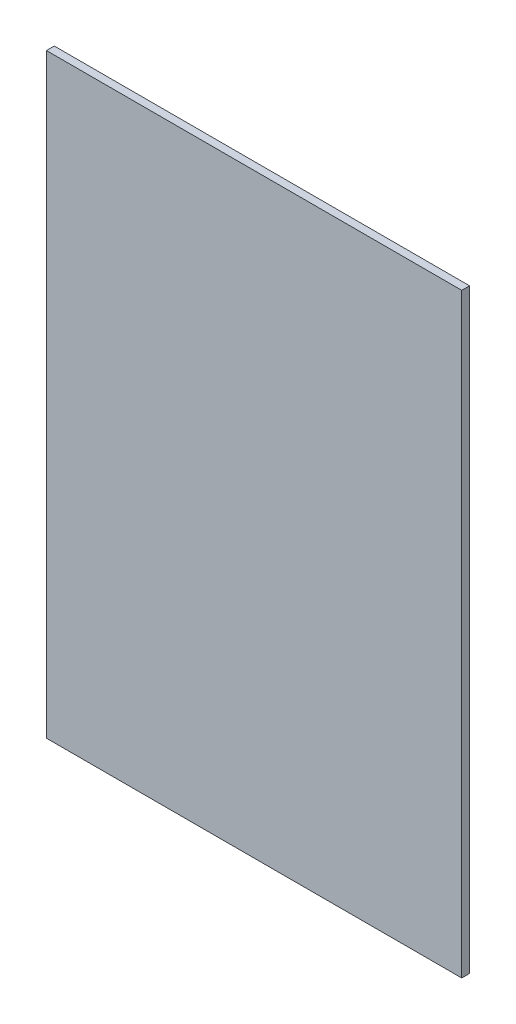
ISO-10303-21;
HEADER;
FILE_DESCRIPTION(('STEP AP214'),'2;1');
FILE_NAME('part.step','',(''),(''),'','','');
FILE_SCHEMA(('AUTOMOTIVE_DESIGN { 1 0 10303 214 1 1 1 1 }'));
ENDSEC;
DATA;
#1=APPLICATION_CONTEXT('core data for automotive mechanical design processes');
#2=APPLICATION_PROTOCOL_DEFINITION('international standard','automotive_design',2000,#1);
#3=PRODUCT_CONTEXT('',#1,'mechanical');
#4=PRODUCT('Part','Part','',(#3));
#5=PRODUCT_RELATED_PRODUCT_CATEGORY('part','',(#4));
#6=PRODUCT_DEFINITION_FORMATION('','',#4);
#7=PRODUCT_DEFINITION_CONTEXT('part definition',#1,'design');
#8=PRODUCT_DEFINITION('design','',#6,#7);
#9=PRODUCT_DEFINITION_SHAPE('','',#8);
#10=(LENGTH_UNIT() NAMED_UNIT(*) SI_UNIT(.MILLI.,.METRE.));
#11=(NAMED_UNIT(*) PLANE_ANGLE_UNIT() SI_UNIT($,.RADIAN.));
#12=(NAMED_UNIT(*) SI_UNIT($,.STERADIAN.) SOLID_ANGLE_UNIT());
#13=UNCERTAINTY_MEASURE_WITH_UNIT(LENGTH_MEASURE(1.E-05),#10,'distance_accuracy_value','');
#14=(GEOMETRIC_REPRESENTATION_CONTEXT(3) GLOBAL_UNCERTAINTY_ASSIGNED_CONTEXT((#13)) GLOBAL_UNIT_ASSIGNED_CONTEXT((#10,
#11,#12)) REPRESENTATION_CONTEXT('',''));
#15=CARTESIAN_POINT('',(0.,0.,0.));
#16=DIRECTION('',(0.,0.,1.));
#17=DIRECTION('',(1.,0.,0.));
#18=AXIS2_PLACEMENT_3D('',#15,#16,#17);
#19=CARTESIAN_POINT('',(0.,0.,0.));
#20=DIRECTION('',(0.,0.,1.));
#21=DIRECTION('',(1.,0.,0.));
#22=AXIS2_PLACEMENT_3D('',#19,#20,#21);
#23=PLANE('',#22);
#24=DIRECTION('',(0.,1.,0.));
#25=VECTOR('',#24,1.);
#26=CARTESIAN_POINT('',(0.,482.6,0.));
#27=LINE('',#26,#25);
#28=CARTESIAN_POINT('',(0.,482.6,0.));
#29=VERTEX_POINT('',#28);
#30=CARTESIAN_POINT('',(0.,0.,0.));
#31=VERTEX_POINT('',#30);
#32=EDGE_CURVE('E95',#29,#31,#27,.F.);
#33=ORIENTED_EDGE('',*,*,#32,.F.);
#34=DIRECTION('',(1.,0.,0.));
#35=VECTOR('',#34,1.);
#36=CARTESIAN_POINT('',(336.55,482.6,0.));
#37=LINE('',#36,#35);
#38=CARTESIAN_POINT('',(336.55,482.6,0.));
#39=VERTEX_POINT('',#38);
#40=EDGE_CURVE('E71',#39,#29,#37,.F.);
#41=ORIENTED_EDGE('',*,*,#40,.F.);
#42=DIRECTION('',(0.,1.,0.));
#43=VECTOR('',#42,1.);
#44=CARTESIAN_POINT('',(336.55,0.,0.));
#45=LINE('',#44,#43);
#46=CARTESIAN_POINT('',(336.55,0.,0.));
#47=VERTEX_POINT('',#46);
#48=EDGE_CURVE('E73',#47,#39,#45,.T.);
#49=ORIENTED_EDGE('',*,*,#48,.F.);
#50=DIRECTION('',(1.,0.,0.));
#51=VECTOR('',#50,1.);
#52=CARTESIAN_POINT('',(0.,0.,0.));
#53=LINE('',#52,#51);
#54=EDGE_CURVE('E36',#31,#47,#53,.T.);
#55=ORIENTED_EDGE('',*,*,#54,.F.);
#56=EDGE_LOOP('',(#33,#41,#49,#55));
#57=FACE_BOUND('',#56,.T.);
#58=ADVANCED_FACE('F33',(#57),#23,.F.);
#59=CARTESIAN_POINT('',(0.,0.,0.));
#60=DIRECTION('',(0.,-1.,0.));
#61=DIRECTION('',(0.,0.,-1.));
#62=AXIS2_PLACEMENT_3D('',#59,#60,#61);
#63=PLANE('',#62);
#64=DIRECTION('',(1.,0.,0.));
#65=VECTOR('',#64,1.);
#66=CARTESIAN_POINT('',(0.,0.,6.35));
#67=LINE('',#66,#65);
#68=CARTESIAN_POINT('',(0.,0.,6.35));
#69=VERTEX_POINT('',#68);
#70=CARTESIAN_POINT('',(336.55,0.,6.35));
#71=VERTEX_POINT('',#70);
#72=EDGE_CURVE('E99',#69,#71,#67,.T.);
#73=ORIENTED_EDGE('',*,*,#72,.F.);
#74=DIRECTION('',(0.,0.,1.));
#75=VECTOR('',#74,1.);
#76=CARTESIAN_POINT('',(0.,0.,0.));
#77=LINE('',#76,#75);
#78=EDGE_CURVE('E84',#31,#69,#77,.T.);
#79=ORIENTED_EDGE('',*,*,#78,.F.);
#80=ORIENTED_EDGE('',*,*,#54,.T.);
#81=DIRECTION('',(0.,0.,-1.));
#82=VECTOR('',#81,1.);
#83=CARTESIAN_POINT('',(336.55,0.,0.));
#84=LINE('',#83,#82);
#85=EDGE_CURVE('E79',#71,#47,#84,.T.);
#86=ORIENTED_EDGE('',*,*,#85,.F.);
#87=EDGE_LOOP('',(#73,#79,#80,#86));
#88=FACE_BOUND('',#87,.T.);
#89=ADVANCED_FACE('F81',(#88),#63,.T.);
#90=CARTESIAN_POINT('',(336.55,0.,0.));
#91=DIRECTION('',(1.,0.,0.));
#92=DIRECTION('',(0.,0.,-1.));
#93=AXIS2_PLACEMENT_3D('',#90,#91,#92);
#94=PLANE('',#93);
#95=DIRECTION('',(0.,1.,0.));
#96=VECTOR('',#95,1.);
#97=CARTESIAN_POINT('',(336.55,0.,6.35));
#98=LINE('',#97,#96);
#99=CARTESIAN_POINT('',(336.55,482.6,6.35));
#100=VERTEX_POINT('',#99);
#101=EDGE_CURVE('E88',#71,#100,#98,.T.);
#102=ORIENTED_EDGE('',*,*,#101,.F.);
#103=ORIENTED_EDGE('',*,*,#85,.T.);
#104=ORIENTED_EDGE('',*,*,#48,.T.);
#105=DIRECTION('',(0.,0.,1.));
#106=VECTOR('',#105,1.);
#107=CARTESIAN_POINT('',(336.55,482.6,0.));
#108=LINE('',#107,#106);
#109=EDGE_CURVE('E91',#100,#39,#108,.F.);
#110=ORIENTED_EDGE('',*,*,#109,.F.);
#111=EDGE_LOOP('',(#102,#103,#104,#110));
#112=FACE_BOUND('',#111,.T.);
#113=ADVANCED_FACE('F86',(#112),#94,.T.);
#114=CARTESIAN_POINT('',(336.55,482.6,0.));
#115=DIRECTION('',(0.,1.,0.));
#116=DIRECTION('',(0.,0.,1.));
#117=AXIS2_PLACEMENT_3D('',#114,#115,#116);
#118=PLANE('',#117);
#119=DIRECTION('',(1.,0.,0.));
#120=VECTOR('',#119,1.);
#121=CARTESIAN_POINT('',(0.,482.6,6.35));
#122=LINE('',#121,#120);
#123=CARTESIAN_POINT('',(0.,482.6,6.35));
#124=VERTEX_POINT('',#123);
#125=EDGE_CURVE('E42',#100,#124,#122,.F.);
#126=ORIENTED_EDGE('',*,*,#125,.F.);
#127=ORIENTED_EDGE('',*,*,#109,.T.);
#128=ORIENTED_EDGE('',*,*,#40,.T.);
#129=DIRECTION('',(0.,0.,1.));
#130=VECTOR('',#129,1.);
#131=CARTESIAN_POINT('',(0.,482.6,0.));
#132=LINE('',#131,#130);
#133=EDGE_CURVE('E51',#124,#29,#132,.F.);
#134=ORIENTED_EDGE('',*,*,#133,.F.);
#135=EDGE_LOOP('',(#126,#127,#128,#134));
#136=FACE_BOUND('',#135,.T.);
#137=ADVANCED_FACE('F105',(#136),#118,.T.);
#138=CARTESIAN_POINT('',(0.,482.6,0.));
#139=DIRECTION('',(-1.,0.,0.));
#140=DIRECTION('',(0.,0.,1.));
#141=AXIS2_PLACEMENT_3D('',#138,#139,#140);
#142=PLANE('',#141);
#143=DIRECTION('',(0.,1.,0.));
#144=VECTOR('',#143,1.);
#145=CARTESIAN_POINT('',(0.,0.,6.35));
#146=LINE('',#145,#144);
#147=EDGE_CURVE('E11',#124,#69,#146,.F.);
#148=ORIENTED_EDGE('',*,*,#147,.F.);
#149=ORIENTED_EDGE('',*,*,#133,.T.);
#150=ORIENTED_EDGE('',*,*,#32,.T.);
#151=ORIENTED_EDGE('',*,*,#78,.T.);
#152=EDGE_LOOP('',(#148,#149,#150,#151));
#153=FACE_BOUND('',#152,.T.);
#154=ADVANCED_FACE('F107',(#153),#142,.T.);
#155=CARTESIAN_POINT('',(0.,0.,6.35));
#156=DIRECTION('',(0.,0.,1.));
#157=DIRECTION('',(1.,0.,0.));
#158=AXIS2_PLACEMENT_3D('',#155,#156,#157);
#159=PLANE('',#158);
#160=ORIENTED_EDGE('',*,*,#125,.T.);
#161=ORIENTED_EDGE('',*,*,#147,.T.);
#162=ORIENTED_EDGE('',*,*,#72,.T.);
#163=ORIENTED_EDGE('',*,*,#101,.T.);
#164=EDGE_LOOP('',(#160,#161,#162,#163));
#165=FACE_BOUND('',#164,.T.);
#166=ADVANCED_FACE('F104',(#165),#159,.T.);
#167=CLOSED_SHELL('',(#58,#89,#113,#137,#154,#166));
#168=MANIFOLD_SOLID_BREP('B2',#167);
#169=ADVANCED_BREP_SHAPE_REPRESENTATION('',(#18,#168),#14);
#170=SHAPE_DEFINITION_REPRESENTATION(#9,#169);
ENDSEC;
END-ISO-10303-21;
